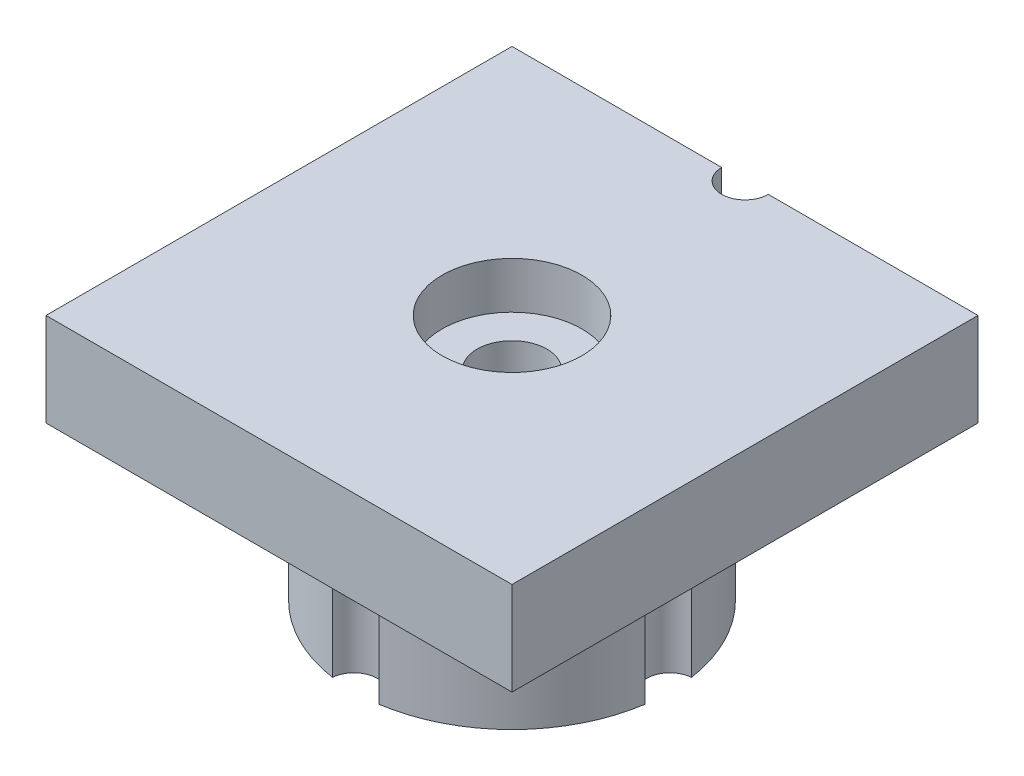
ISO-10303-21;
HEADER;
FILE_DESCRIPTION(('STEP AP214'),'2;1');
FILE_NAME('part.step','',(''),(''),'','','');
FILE_SCHEMA(('AUTOMOTIVE_DESIGN { 1 0 10303 214 1 1 1 1 }'));
ENDSEC;
DATA;
#1=APPLICATION_CONTEXT('core data for automotive mechanical design processes');
#2=APPLICATION_PROTOCOL_DEFINITION('international standard','automotive_design',2000,#1);
#3=PRODUCT_CONTEXT('',#1,'mechanical');
#4=PRODUCT('Part','Part','',(#3));
#5=PRODUCT_RELATED_PRODUCT_CATEGORY('part','',(#4));
#6=PRODUCT_DEFINITION_FORMATION('','',#4);
#7=PRODUCT_DEFINITION_CONTEXT('part definition',#1,'design');
#8=PRODUCT_DEFINITION('design','',#6,#7);
#9=PRODUCT_DEFINITION_SHAPE('','',#8);
#10=(LENGTH_UNIT() NAMED_UNIT(*) SI_UNIT(.MILLI.,.METRE.));
#11=(NAMED_UNIT(*) PLANE_ANGLE_UNIT() SI_UNIT($,.RADIAN.));
#12=(NAMED_UNIT(*) SI_UNIT($,.STERADIAN.) SOLID_ANGLE_UNIT());
#13=UNCERTAINTY_MEASURE_WITH_UNIT(LENGTH_MEASURE(1.E-05),#10,'distance_accuracy_value','');
#14=(GEOMETRIC_REPRESENTATION_CONTEXT(3) GLOBAL_UNCERTAINTY_ASSIGNED_CONTEXT((#13)) GLOBAL_UNIT_ASSIGNED_CONTEXT((#10,
#11,#12)) REPRESENTATION_CONTEXT('',''));
#15=CARTESIAN_POINT('',(0.,0.,0.));
#16=DIRECTION('',(0.,0.,1.));
#17=DIRECTION('',(1.,0.,0.));
#18=AXIS2_PLACEMENT_3D('',#15,#16,#17);
#19=CARTESIAN_POINT('',(-5.,2.,-5.));
#20=DIRECTION('',(0.,0.,1.));
#21=DIRECTION('',(1.,0.,0.));
#22=AXIS2_PLACEMENT_3D('',#19,#20,#21);
#23=PLANE('',#22);
#24=DIRECTION('',(-1.,0.,0.));
#25=VECTOR('',#24,1.);
#26=CARTESIAN_POINT('',(-5.,0.,-5.));
#27=LINE('',#26,#25);
#28=CARTESIAN_POINT('',(5.,0.,-5.));
#29=VERTEX_POINT('',#28);
#30=CARTESIAN_POINT('',(0.499999999999999,0.,-5.));
#31=VERTEX_POINT('',#30);
#32=EDGE_CURVE('E147',#29,#31,#27,.T.);
#33=ORIENTED_EDGE('',*,*,#32,.T.);
#34=DIRECTION('',(0.,1.,0.));
#35=VECTOR('',#34,1.);
#36=CARTESIAN_POINT('',(0.499999999999999,-3.3,-5.));
#37=LINE('',#36,#35);
#38=CARTESIAN_POINT('',(0.499999999999999,2.,-5.));
#39=VERTEX_POINT('',#38);
#40=EDGE_CURVE('E137',#31,#39,#37,.T.);
#41=ORIENTED_EDGE('',*,*,#40,.T.);
#42=DIRECTION('',(-1.,0.,0.));
#43=VECTOR('',#42,1.);
#44=CARTESIAN_POINT('',(-5.,2.,-5.));
#45=LINE('',#44,#43);
#46=CARTESIAN_POINT('',(5.,2.,-5.));
#47=VERTEX_POINT('',#46);
#48=EDGE_CURVE('E145',#47,#39,#45,.T.);
#49=ORIENTED_EDGE('',*,*,#48,.F.);
#50=DIRECTION('',(0.,-1.,0.));
#51=VECTOR('',#50,1.);
#52=CARTESIAN_POINT('',(5.,2.,-5.));
#53=LINE('',#52,#51);
#54=EDGE_CURVE('E11',#47,#29,#53,.T.);
#55=ORIENTED_EDGE('',*,*,#54,.T.);
#56=EDGE_LOOP('',(#33,#41,#49,#55));
#57=FACE_BOUND('',#56,.T.);
#58=ADVANCED_FACE('F35',(#57),#23,.F.);
#59=CARTESIAN_POINT('',(0.,3.3,0.));
#60=DIRECTION('',(0.,-1.,0.));
#61=DIRECTION('',(0.,0.,-1.));
#62=AXIS2_PLACEMENT_3D('',#59,#60,#61);
#63=CYLINDRICAL_SURFACE('',#62,0.75);
#64=CARTESIAN_POINT('',(0.,0.,0.));
#65=DIRECTION('',(0.,-1.,0.));
#66=DIRECTION('',(0.,0.,-1.));
#67=AXIS2_PLACEMENT_3D('',#64,#65,#66);
#68=CIRCLE('',#67,0.75);
#69=CARTESIAN_POINT('',(0.,0.,-0.75));
#70=VERTEX_POINT('',#69);
#71=EDGE_CURVE('E406',#70,#70,#68,.T.);
#72=ORIENTED_EDGE('',*,*,#71,.T.);
#73=EDGE_LOOP('',(#72));
#74=FACE_BOUND('',#73,.T.);
#75=CARTESIAN_POINT('',(0.,1.,0.));
#76=DIRECTION('',(0.,1.,0.));
#77=DIRECTION('',(0.,0.,1.));
#78=AXIS2_PLACEMENT_3D('',#75,#76,#77);
#79=CIRCLE('',#78,0.75);
#80=CARTESIAN_POINT('',(0.,1.,0.75));
#81=VERTEX_POINT('',#80);
#82=EDGE_CURVE('E39',#81,#81,#79,.F.);
#83=ORIENTED_EDGE('',*,*,#82,.F.);
#84=EDGE_LOOP('',(#83));
#85=FACE_BOUND('',#84,.T.);
#86=ADVANCED_FACE('F202',(#74,#85),#63,.F.);
#87=CARTESIAN_POINT('',(0.,0.,0.));
#88=DIRECTION('',(0.,-1.,0.));
#89=DIRECTION('',(0.,0.,-1.));
#90=AXIS2_PLACEMENT_3D('',#87,#88,#89);
#91=PLANE('',#90);
#92=CARTESIAN_POINT('',(0.,0.,-5.));
#93=DIRECTION('',(0.,-1.,0.));
#94=DIRECTION('',(0.,0.,-1.));
#95=AXIS2_PLACEMENT_3D('',#92,#93,#94);
#96=CIRCLE('',#95,0.5);
#97=CARTESIAN_POINT('',(-0.500000000000002,0.,-5.));
#98=VERTEX_POINT('',#97);
#99=EDGE_CURVE('E413',#31,#98,#96,.T.);
#100=ORIENTED_EDGE('',*,*,#99,.F.);
#101=ORIENTED_EDGE('',*,*,#32,.F.);
#102=DIRECTION('',(0.,0.,-1.));
#103=VECTOR('',#102,1.);
#104=CARTESIAN_POINT('',(5.,0.,5.));
#105=LINE('',#104,#103);
#106=CARTESIAN_POINT('',(5.,0.,5.));
#107=VERTEX_POINT('',#106);
#108=EDGE_CURVE('E163',#107,#29,#105,.T.);
#109=ORIENTED_EDGE('',*,*,#108,.F.);
#110=DIRECTION('',(1.,0.,0.));
#111=VECTOR('',#110,1.);
#112=CARTESIAN_POINT('',(-5.,0.,5.));
#113=LINE('',#112,#111);
#114=CARTESIAN_POINT('',(-5.,0.,5.));
#115=VERTEX_POINT('',#114);
#116=EDGE_CURVE('E171',#115,#107,#113,.T.);
#117=ORIENTED_EDGE('',*,*,#116,.F.);
#118=DIRECTION('',(0.,0.,1.));
#119=VECTOR('',#118,1.);
#120=CARTESIAN_POINT('',(-5.,0.,5.));
#121=LINE('',#120,#119);
#122=CARTESIAN_POINT('',(-5.,0.,-5.));
#123=VERTEX_POINT('',#122);
#124=EDGE_CURVE('E169',#123,#115,#121,.T.);
#125=ORIENTED_EDGE('',*,*,#124,.F.);
#126=EDGE_CURVE('E166',#98,#123,#27,.T.);
#127=ORIENTED_EDGE('',*,*,#126,.F.);
#128=EDGE_LOOP('',(#100,#101,#109,#117,#125,#127));
#129=FACE_BOUND('',#128,.T.);
#130=CARTESIAN_POINT('',(0.,0.,0.));
#131=DIRECTION('',(0.,-1.,0.));
#132=DIRECTION('',(0.,0.,-1.));
#133=AXIS2_PLACEMENT_3D('',#130,#131,#132);
#134=CIRCLE('',#133,3.39);
#135=CARTESIAN_POINT('',(3.35312684365782,0.,0.49863851670459));
#136=VERTEX_POINT('',#135);
#137=CARTESIAN_POINT('',(0.498638516704619,0.,3.35312684365782));
#138=VERTEX_POINT('',#137);
#139=EDGE_CURVE('E59',#136,#138,#134,.T.);
#140=ORIENTED_EDGE('',*,*,#139,.F.);
#141=CARTESIAN_POINT('',(3.39,0.,0.));
#142=DIRECTION('',(0.,1.,0.));
#143=DIRECTION('',(0.,0.,-1.));
#144=AXIS2_PLACEMENT_3D('',#141,#142,#143);
#145=CIRCLE('',#144,0.500000000000012);
#146=CARTESIAN_POINT('',(3.35312684365781,0.,-0.498638516704625));
#147=VERTEX_POINT('',#146);
#148=EDGE_CURVE('E426',#147,#136,#145,.T.);
#149=ORIENTED_EDGE('',*,*,#148,.F.);
#150=CARTESIAN_POINT('',(0.,0.,0.));
#151=DIRECTION('',(0.,-1.,0.));
#152=DIRECTION('',(0.,0.,-1.));
#153=AXIS2_PLACEMENT_3D('',#150,#151,#152);
#154=CIRCLE('',#153,3.39);
#155=CARTESIAN_POINT('',(0.498638516704585,0.,-3.35312684365782));
#156=VERTEX_POINT('',#155);
#157=EDGE_CURVE('E457',#156,#147,#154,.T.);
#158=ORIENTED_EDGE('',*,*,#157,.F.);
#159=CARTESIAN_POINT('',(0.,0.,-3.39));
#160=DIRECTION('',(0.,1.,0.));
#161=DIRECTION('',(0.,0.,-1.));
#162=AXIS2_PLACEMENT_3D('',#159,#160,#161);
#163=CIRCLE('',#162,0.500000000000018);
#164=CARTESIAN_POINT('',(-0.498638516704636,0.,-3.35312684365781));
#165=VERTEX_POINT('',#164);
#166=EDGE_CURVE('E454',#165,#156,#163,.T.);
#167=ORIENTED_EDGE('',*,*,#166,.F.);
#168=CARTESIAN_POINT('',(0.,0.,0.));
#169=DIRECTION('',(0.,-1.,0.));
#170=DIRECTION('',(0.,0.,-1.));
#171=AXIS2_PLACEMENT_3D('',#168,#169,#170);
#172=CIRCLE('',#171,3.39);
#173=CARTESIAN_POINT('',(-3.35312684365782,0.,-0.498638516704602));
#174=VERTEX_POINT('',#173);
#175=EDGE_CURVE('E451',#174,#165,#172,.T.);
#176=ORIENTED_EDGE('',*,*,#175,.F.);
#177=CARTESIAN_POINT('',(-3.39,0.,0.));
#178=DIRECTION('',(0.,1.,0.));
#179=DIRECTION('',(0.,0.,-1.));
#180=AXIS2_PLACEMENT_3D('',#177,#178,#179);
#181=CIRCLE('',#180,0.5);
#182=CARTESIAN_POINT('',(-3.35312684365782,0.,0.498638516704603));
#183=VERTEX_POINT('',#182);
#184=EDGE_CURVE('E448',#183,#174,#181,.T.);
#185=ORIENTED_EDGE('',*,*,#184,.F.);
#186=CARTESIAN_POINT('',(0.,0.,0.));
#187=DIRECTION('',(0.,-1.,0.));
#188=DIRECTION('',(0.,0.,-1.));
#189=AXIS2_PLACEMENT_3D('',#186,#187,#188);
#190=CIRCLE('',#189,3.39);
#191=CARTESIAN_POINT('',(-0.498638516704596,0.,3.35312684365782));
#192=VERTEX_POINT('',#191);
#193=EDGE_CURVE('E445',#192,#183,#190,.T.);
#194=ORIENTED_EDGE('',*,*,#193,.F.);
#195=CARTESIAN_POINT('',(0.,0.,3.39));
#196=DIRECTION('',(0.,1.,0.));
#197=DIRECTION('',(0.,0.,-1.));
#198=AXIS2_PLACEMENT_3D('',#195,#196,#197);
#199=CIRCLE('',#198,0.500000000000006);
#200=EDGE_CURVE('E442',#138,#192,#199,.T.);
#201=ORIENTED_EDGE('',*,*,#200,.F.);
#202=EDGE_LOOP('',(#140,#149,#158,#167,#176,#185,#194,#201));
#203=FACE_BOUND('',#202,.T.);
#204=ADVANCED_FACE('F189',(#129,#203),#91,.T.);
#205=CARTESIAN_POINT('',(5.,2.,5.));
#206=DIRECTION('',(-1.,0.,0.));
#207=DIRECTION('',(0.,0.,1.));
#208=AXIS2_PLACEMENT_3D('',#205,#206,#207);
#209=PLANE('',#208);
#210=ORIENTED_EDGE('',*,*,#108,.T.);
#211=ORIENTED_EDGE('',*,*,#54,.F.);
#212=DIRECTION('',(0.,0.,-1.));
#213=VECTOR('',#212,1.);
#214=CARTESIAN_POINT('',(5.,2.,5.));
#215=LINE('',#214,#213);
#216=CARTESIAN_POINT('',(5.,2.,5.));
#217=VERTEX_POINT('',#216);
#218=EDGE_CURVE('E151',#217,#47,#215,.T.);
#219=ORIENTED_EDGE('',*,*,#218,.F.);
#220=DIRECTION('',(0.,-1.,0.));
#221=VECTOR('',#220,1.);
#222=CARTESIAN_POINT('',(5.,2.,5.));
#223=LINE('',#222,#221);
#224=EDGE_CURVE('E162',#217,#107,#223,.T.);
#225=ORIENTED_EDGE('',*,*,#224,.T.);
#226=EDGE_LOOP('',(#210,#211,#219,#225));
#227=FACE_BOUND('',#226,.T.);
#228=ADVANCED_FACE('F37',(#227),#209,.F.);
#229=CARTESIAN_POINT('',(-0.500000000000002,2.,-5.));
#230=VERTEX_POINT('',#229);
#231=CARTESIAN_POINT('',(-5.,2.,-5.));
#232=VERTEX_POINT('',#231);
#233=EDGE_CURVE('E154',#230,#232,#45,.T.);
#234=ORIENTED_EDGE('',*,*,#233,.F.);
#235=DIRECTION('',(0.,1.,0.));
#236=VECTOR('',#235,1.);
#237=CARTESIAN_POINT('',(-0.500000000000002,-3.3,-5.));
#238=LINE('',#237,#236);
#239=EDGE_CURVE('E51',#98,#230,#238,.T.);
#240=ORIENTED_EDGE('',*,*,#239,.F.);
#241=ORIENTED_EDGE('',*,*,#126,.T.);
#242=DIRECTION('',(0.,-1.,0.));
#243=VECTOR('',#242,1.);
#244=CARTESIAN_POINT('',(-5.,2.,-5.));
#245=LINE('',#244,#243);
#246=EDGE_CURVE('E44',#232,#123,#245,.T.);
#247=ORIENTED_EDGE('',*,*,#246,.F.);
#248=EDGE_LOOP('',(#234,#240,#241,#247));
#249=FACE_BOUND('',#248,.T.);
#250=ADVANCED_FACE('F197',(#249),#23,.F.);
#251=CARTESIAN_POINT('',(-5.,2.,5.));
#252=DIRECTION('',(1.,0.,0.));
#253=DIRECTION('',(0.,0.,-1.));
#254=AXIS2_PLACEMENT_3D('',#251,#252,#253);
#255=PLANE('',#254);
#256=ORIENTED_EDGE('',*,*,#124,.T.);
#257=DIRECTION('',(0.,-1.,0.));
#258=VECTOR('',#257,1.);
#259=CARTESIAN_POINT('',(-5.,2.,5.));
#260=LINE('',#259,#258);
#261=CARTESIAN_POINT('',(-5.,2.,5.));
#262=VERTEX_POINT('',#261);
#263=EDGE_CURVE('E175',#262,#115,#260,.T.);
#264=ORIENTED_EDGE('',*,*,#263,.F.);
#265=DIRECTION('',(0.,0.,1.));
#266=VECTOR('',#265,1.);
#267=CARTESIAN_POINT('',(-5.,2.,5.));
#268=LINE('',#267,#266);
#269=EDGE_CURVE('E153',#232,#262,#268,.T.);
#270=ORIENTED_EDGE('',*,*,#269,.F.);
#271=ORIENTED_EDGE('',*,*,#246,.T.);
#272=EDGE_LOOP('',(#256,#264,#270,#271));
#273=FACE_BOUND('',#272,.T.);
#274=ADVANCED_FACE('F183',(#273),#255,.F.);
#275=CARTESIAN_POINT('',(-5.,2.,5.));
#276=DIRECTION('',(0.,0.,-1.));
#277=DIRECTION('',(-1.,0.,0.));
#278=AXIS2_PLACEMENT_3D('',#275,#276,#277);
#279=PLANE('',#278);
#280=ORIENTED_EDGE('',*,*,#116,.T.);
#281=ORIENTED_EDGE('',*,*,#224,.F.);
#282=DIRECTION('',(1.,0.,0.));
#283=VECTOR('',#282,1.);
#284=CARTESIAN_POINT('',(-5.,2.,5.));
#285=LINE('',#284,#283);
#286=EDGE_CURVE('E156',#262,#217,#285,.T.);
#287=ORIENTED_EDGE('',*,*,#286,.F.);
#288=ORIENTED_EDGE('',*,*,#263,.T.);
#289=EDGE_LOOP('',(#280,#281,#287,#288));
#290=FACE_BOUND('',#289,.T.);
#291=ADVANCED_FACE('F193',(#290),#279,.F.);
#292=CARTESIAN_POINT('',(0.,2.,0.));
#293=DIRECTION('',(0.,-1.,0.));
#294=DIRECTION('',(0.,0.,-1.));
#295=AXIS2_PLACEMENT_3D('',#292,#293,#294);
#296=PLANE('',#295);
#297=CARTESIAN_POINT('',(0.,2.,0.));
#298=DIRECTION('',(0.,1.,0.));
#299=DIRECTION('',(0.,0.,1.));
#300=AXIS2_PLACEMENT_3D('',#297,#298,#299);
#301=CIRCLE('',#300,1.5);
#302=CARTESIAN_POINT('',(0.,2.,1.5));
#303=VERTEX_POINT('',#302);
#304=EDGE_CURVE('E410',#303,#303,#301,.T.);
#305=ORIENTED_EDGE('',*,*,#304,.F.);
#306=EDGE_LOOP('',(#305));
#307=FACE_BOUND('',#306,.T.);
#308=ORIENTED_EDGE('',*,*,#48,.T.);
#309=CARTESIAN_POINT('',(0.,2.,-5.));
#310=DIRECTION('',(0.,1.,0.));
#311=DIRECTION('',(0.,0.,1.));
#312=AXIS2_PLACEMENT_3D('',#309,#310,#311);
#313=CIRCLE('',#312,0.5);
#314=EDGE_CURVE('E134',#230,#39,#313,.T.);
#315=ORIENTED_EDGE('',*,*,#314,.F.);
#316=ORIENTED_EDGE('',*,*,#233,.T.);
#317=ORIENTED_EDGE('',*,*,#269,.T.);
#318=ORIENTED_EDGE('',*,*,#286,.T.);
#319=ORIENTED_EDGE('',*,*,#218,.T.);
#320=EDGE_LOOP('',(#308,#315,#316,#317,#318,#319));
#321=FACE_BOUND('',#320,.T.);
#322=ADVANCED_FACE('F149',(#307,#321),#296,.F.);
#323=CARTESIAN_POINT('',(0.,-3.3,0.));
#324=DIRECTION('',(0.,1.,0.));
#325=DIRECTION('',(0.,0.,1.));
#326=AXIS2_PLACEMENT_3D('',#323,#324,#325);
#327=CYLINDRICAL_SURFACE('',#326,3.39);
#328=ORIENTED_EDGE('',*,*,#139,.T.);
#329=DIRECTION('',(0.,1.,0.));
#330=VECTOR('',#329,1.);
#331=CARTESIAN_POINT('',(0.498638516704619,-3.3,3.35312684365782));
#332=LINE('',#331,#330);
#333=CARTESIAN_POINT('',(0.498638516704619,-3.3,3.35312684365782));
#334=VERTEX_POINT('',#333);
#335=EDGE_CURVE('E167',#334,#138,#332,.T.);
#336=ORIENTED_EDGE('',*,*,#335,.F.);
#337=CARTESIAN_POINT('',(0.,-3.3,0.));
#338=DIRECTION('',(0.,-1.,0.));
#339=DIRECTION('',(0.,0.,-1.));
#340=AXIS2_PLACEMENT_3D('',#337,#338,#339);
#341=CIRCLE('',#340,3.39);
#342=CARTESIAN_POINT('',(3.35312684365782,-3.3,0.49863851670459));
#343=VERTEX_POINT('',#342);
#344=EDGE_CURVE('E422',#343,#334,#341,.T.);
#345=ORIENTED_EDGE('',*,*,#344,.F.);
#346=DIRECTION('',(0.,1.,0.));
#347=VECTOR('',#346,1.);
#348=CARTESIAN_POINT('',(3.35312684365782,-3.3,0.49863851670459));
#349=LINE('',#348,#347);
#350=EDGE_CURVE('E440',#343,#136,#349,.T.);
#351=ORIENTED_EDGE('',*,*,#350,.T.);
#352=EDGE_LOOP('',(#328,#336,#345,#351));
#353=FACE_BOUND('',#352,.T.);
#354=ADVANCED_FACE('F217',(#353),#327,.T.);
#355=CARTESIAN_POINT('',(0.,-3.3,3.39));
#356=DIRECTION('',(0.,1.,0.));
#357=DIRECTION('',(0.,0.,1.));
#358=AXIS2_PLACEMENT_3D('',#355,#356,#357);
#359=CYLINDRICAL_SURFACE('',#358,0.500000000000006);
#360=ORIENTED_EDGE('',*,*,#200,.T.);
#361=DIRECTION('',(0.,1.,0.));
#362=VECTOR('',#361,1.);
#363=CARTESIAN_POINT('',(-0.498638516704596,-3.3,3.35312684365782));
#364=LINE('',#363,#362);
#365=CARTESIAN_POINT('',(-0.498638516704596,-3.3,3.35312684365782));
#366=VERTEX_POINT('',#365);
#367=EDGE_CURVE('E478',#366,#192,#364,.T.);
#368=ORIENTED_EDGE('',*,*,#367,.F.);
#369=CARTESIAN_POINT('',(0.,-3.3,3.39));
#370=DIRECTION('',(0.,1.,0.));
#371=DIRECTION('',(0.,0.,-1.));
#372=AXIS2_PLACEMENT_3D('',#369,#370,#371);
#373=CIRCLE('',#372,0.500000000000006);
#374=EDGE_CURVE('E425',#334,#366,#373,.T.);
#375=ORIENTED_EDGE('',*,*,#374,.F.);
#376=ORIENTED_EDGE('',*,*,#335,.T.);
#377=EDGE_LOOP('',(#360,#368,#375,#376));
#378=FACE_BOUND('',#377,.T.);
#379=ADVANCED_FACE('F221',(#378),#359,.F.);
#380=CARTESIAN_POINT('',(0.,-3.3,0.));
#381=DIRECTION('',(0.,1.,0.));
#382=DIRECTION('',(0.,0.,1.));
#383=AXIS2_PLACEMENT_3D('',#380,#381,#382);
#384=CYLINDRICAL_SURFACE('',#383,3.39);
#385=ORIENTED_EDGE('',*,*,#193,.T.);
#386=DIRECTION('',(0.,1.,0.));
#387=VECTOR('',#386,1.);
#388=CARTESIAN_POINT('',(-3.35312684365782,-3.3,0.498638516704603));
#389=LINE('',#388,#387);
#390=CARTESIAN_POINT('',(-3.35312684365782,-3.3,0.498638516704603));
#391=VERTEX_POINT('',#390);
#392=EDGE_CURVE('E475',#391,#183,#389,.T.);
#393=ORIENTED_EDGE('',*,*,#392,.F.);
#394=CARTESIAN_POINT('',(0.,-3.3,0.));
#395=DIRECTION('',(0.,-1.,0.));
#396=DIRECTION('',(0.,0.,-1.));
#397=AXIS2_PLACEMENT_3D('',#394,#395,#396);
#398=CIRCLE('',#397,3.39);
#399=EDGE_CURVE('E428',#366,#391,#398,.T.);
#400=ORIENTED_EDGE('',*,*,#399,.F.);
#401=ORIENTED_EDGE('',*,*,#367,.T.);
#402=EDGE_LOOP('',(#385,#393,#400,#401));
#403=FACE_BOUND('',#402,.T.);
#404=ADVANCED_FACE('F225',(#403),#384,.T.);
#405=CARTESIAN_POINT('',(-3.39,-3.3,0.));
#406=DIRECTION('',(0.,1.,0.));
#407=DIRECTION('',(0.,0.,1.));
#408=AXIS2_PLACEMENT_3D('',#405,#406,#407);
#409=CYLINDRICAL_SURFACE('',#408,0.5);
#410=ORIENTED_EDGE('',*,*,#184,.T.);
#411=DIRECTION('',(0.,1.,0.));
#412=VECTOR('',#411,1.);
#413=CARTESIAN_POINT('',(-3.35312684365782,-3.3,-0.498638516704602));
#414=LINE('',#413,#412);
#415=CARTESIAN_POINT('',(-3.35312684365782,-3.3,-0.498638516704602));
#416=VERTEX_POINT('',#415);
#417=EDGE_CURVE('E472',#416,#174,#414,.T.);
#418=ORIENTED_EDGE('',*,*,#417,.F.);
#419=CARTESIAN_POINT('',(-3.39,-3.3,0.));
#420=DIRECTION('',(0.,1.,0.));
#421=DIRECTION('',(0.,0.,-1.));
#422=AXIS2_PLACEMENT_3D('',#419,#420,#421);
#423=CIRCLE('',#422,0.5);
#424=EDGE_CURVE('E430',#391,#416,#423,.T.);
#425=ORIENTED_EDGE('',*,*,#424,.F.);
#426=ORIENTED_EDGE('',*,*,#392,.T.);
#427=EDGE_LOOP('',(#410,#418,#425,#426));
#428=FACE_BOUND('',#427,.T.);
#429=ADVANCED_FACE('F229',(#428),#409,.F.);
#430=CARTESIAN_POINT('',(0.,-3.3,0.));
#431=DIRECTION('',(0.,1.,0.));
#432=DIRECTION('',(0.,0.,1.));
#433=AXIS2_PLACEMENT_3D('',#430,#431,#432);
#434=CYLINDRICAL_SURFACE('',#433,3.39);
#435=ORIENTED_EDGE('',*,*,#175,.T.);
#436=DIRECTION('',(0.,1.,0.));
#437=VECTOR('',#436,1.);
#438=CARTESIAN_POINT('',(-0.498638516704636,-3.3,-3.35312684365781));
#439=LINE('',#438,#437);
#440=CARTESIAN_POINT('',(-0.498638516704636,-3.3,-3.35312684365781));
#441=VERTEX_POINT('',#440);
#442=EDGE_CURVE('E469',#441,#165,#439,.T.);
#443=ORIENTED_EDGE('',*,*,#442,.F.);
#444=CARTESIAN_POINT('',(0.,-3.3,0.));
#445=DIRECTION('',(0.,-1.,0.));
#446=DIRECTION('',(0.,0.,-1.));
#447=AXIS2_PLACEMENT_3D('',#444,#445,#446);
#448=CIRCLE('',#447,3.39);
#449=EDGE_CURVE('E432',#416,#441,#448,.T.);
#450=ORIENTED_EDGE('',*,*,#449,.F.);
#451=ORIENTED_EDGE('',*,*,#417,.T.);
#452=EDGE_LOOP('',(#435,#443,#450,#451));
#453=FACE_BOUND('',#452,.T.);
#454=ADVANCED_FACE('F233',(#453),#434,.T.);
#455=CARTESIAN_POINT('',(0.,-3.3,-3.39));
#456=DIRECTION('',(0.,1.,0.));
#457=DIRECTION('',(0.,0.,1.));
#458=AXIS2_PLACEMENT_3D('',#455,#456,#457);
#459=CYLINDRICAL_SURFACE('',#458,0.500000000000018);
#460=ORIENTED_EDGE('',*,*,#166,.T.);
#461=DIRECTION('',(0.,1.,0.));
#462=VECTOR('',#461,1.);
#463=CARTESIAN_POINT('',(0.498638516704585,-3.3,-3.35312684365782));
#464=LINE('',#463,#462);
#465=CARTESIAN_POINT('',(0.498638516704585,-3.3,-3.35312684365782));
#466=VERTEX_POINT('',#465);
#467=EDGE_CURVE('E466',#466,#156,#464,.T.);
#468=ORIENTED_EDGE('',*,*,#467,.F.);
#469=CARTESIAN_POINT('',(0.,-3.3,-3.39));
#470=DIRECTION('',(0.,1.,0.));
#471=DIRECTION('',(0.,0.,-1.));
#472=AXIS2_PLACEMENT_3D('',#469,#470,#471);
#473=CIRCLE('',#472,0.500000000000018);
#474=EDGE_CURVE('E434',#441,#466,#473,.T.);
#475=ORIENTED_EDGE('',*,*,#474,.F.);
#476=ORIENTED_EDGE('',*,*,#442,.T.);
#477=EDGE_LOOP('',(#460,#468,#475,#476));
#478=FACE_BOUND('',#477,.T.);
#479=ADVANCED_FACE('F237',(#478),#459,.F.);
#480=CARTESIAN_POINT('',(0.,-3.3,0.));
#481=DIRECTION('',(0.,1.,0.));
#482=DIRECTION('',(0.,0.,1.));
#483=AXIS2_PLACEMENT_3D('',#480,#481,#482);
#484=CYLINDRICAL_SURFACE('',#483,3.39);
#485=ORIENTED_EDGE('',*,*,#157,.T.);
#486=DIRECTION('',(0.,1.,0.));
#487=VECTOR('',#486,1.);
#488=CARTESIAN_POINT('',(3.35312684365781,-3.3,-0.498638516704625));
#489=LINE('',#488,#487);
#490=CARTESIAN_POINT('',(3.35312684365781,-3.3,-0.498638516704625));
#491=VERTEX_POINT('',#490);
#492=EDGE_CURVE('E463',#491,#147,#489,.T.);
#493=ORIENTED_EDGE('',*,*,#492,.F.);
#494=CARTESIAN_POINT('',(0.,-3.3,0.));
#495=DIRECTION('',(0.,-1.,0.));
#496=DIRECTION('',(0.,0.,-1.));
#497=AXIS2_PLACEMENT_3D('',#494,#495,#496);
#498=CIRCLE('',#497,3.39);
#499=EDGE_CURVE('E436',#466,#491,#498,.T.);
#500=ORIENTED_EDGE('',*,*,#499,.F.);
#501=ORIENTED_EDGE('',*,*,#467,.T.);
#502=EDGE_LOOP('',(#485,#493,#500,#501));
#503=FACE_BOUND('',#502,.T.);
#504=ADVANCED_FACE('F241',(#503),#484,.T.);
#505=CARTESIAN_POINT('',(3.39,-3.3,0.));
#506=DIRECTION('',(0.,1.,0.));
#507=DIRECTION('',(0.,0.,1.));
#508=AXIS2_PLACEMENT_3D('',#505,#506,#507);
#509=CYLINDRICAL_SURFACE('',#508,0.500000000000012);
#510=ORIENTED_EDGE('',*,*,#148,.T.);
#511=ORIENTED_EDGE('',*,*,#350,.F.);
#512=CARTESIAN_POINT('',(3.39,-3.3,0.));
#513=DIRECTION('',(0.,1.,0.));
#514=DIRECTION('',(0.,0.,-1.));
#515=AXIS2_PLACEMENT_3D('',#512,#513,#514);
#516=CIRCLE('',#515,0.500000000000012);
#517=EDGE_CURVE('E438',#491,#343,#516,.T.);
#518=ORIENTED_EDGE('',*,*,#517,.F.);
#519=ORIENTED_EDGE('',*,*,#492,.T.);
#520=EDGE_LOOP('',(#510,#511,#518,#519));
#521=FACE_BOUND('',#520,.T.);
#522=ADVANCED_FACE('F245',(#521),#509,.F.);
#523=CARTESIAN_POINT('',(0.,-3.3,1.695));
#524=DIRECTION('',(0.,-1.,0.));
#525=DIRECTION('',(0.,0.,-1.));
#526=AXIS2_PLACEMENT_3D('',#523,#524,#525);
#527=PLANE('',#526);
#528=CARTESIAN_POINT('',(0.,-3.3,0.));
#529=DIRECTION('',(0.,-1.,0.));
#530=DIRECTION('',(0.,0.,-1.));
#531=AXIS2_PLACEMENT_3D('',#528,#529,#530);
#532=CIRCLE('',#531,2.);
#533=CARTESIAN_POINT('',(0.,-3.3,-2.));
#534=VERTEX_POINT('',#533);
#535=EDGE_CURVE('E408',#534,#534,#532,.T.);
#536=ORIENTED_EDGE('',*,*,#535,.F.);
#537=EDGE_LOOP('',(#536));
#538=FACE_BOUND('',#537,.T.);
#539=ORIENTED_EDGE('',*,*,#344,.T.);
#540=ORIENTED_EDGE('',*,*,#374,.T.);
#541=ORIENTED_EDGE('',*,*,#399,.T.);
#542=ORIENTED_EDGE('',*,*,#424,.T.);
#543=ORIENTED_EDGE('',*,*,#449,.T.);
#544=ORIENTED_EDGE('',*,*,#474,.T.);
#545=ORIENTED_EDGE('',*,*,#499,.T.);
#546=ORIENTED_EDGE('',*,*,#517,.T.);
#547=EDGE_LOOP('',(#539,#540,#541,#542,#543,#544,#545,#546));
#548=FACE_BOUND('',#547,.T.);
#549=ADVANCED_FACE('F249',(#538,#548),#527,.T.);
#550=CARTESIAN_POINT('',(0.,0.,0.));
#551=DIRECTION('',(0.,-1.,0.));
#552=DIRECTION('',(0.,0.,-1.));
#553=AXIS2_PLACEMENT_3D('',#550,#551,#552);
#554=CYLINDRICAL_SURFACE('',#553,2.);
#555=CARTESIAN_POINT('',(0.,0.,0.));
#556=DIRECTION('',(0.,-1.,0.));
#557=DIRECTION('',(0.,0.,-1.));
#558=AXIS2_PLACEMENT_3D('',#555,#556,#557);
#559=CIRCLE('',#558,2.);
#560=CARTESIAN_POINT('',(0.,0.,-2.));
#561=VERTEX_POINT('',#560);
#562=EDGE_CURVE('E417',#561,#561,#559,.T.);
#563=ORIENTED_EDGE('',*,*,#562,.F.);
#564=EDGE_LOOP('',(#563));
#565=FACE_BOUND('',#564,.T.);
#566=ORIENTED_EDGE('',*,*,#535,.T.);
#567=EDGE_LOOP('',(#566));
#568=FACE_BOUND('',#567,.T.);
#569=ADVANCED_FACE('F253',(#565,#568),#554,.F.);
#570=CARTESIAN_POINT('',(0.,0.,0.));
#571=DIRECTION('',(0.,-1.,0.));
#572=DIRECTION('',(0.,0.,-1.));
#573=AXIS2_PLACEMENT_3D('',#570,#571,#572);
#574=PLANE('',#573);
#575=ORIENTED_EDGE('',*,*,#71,.F.);
#576=EDGE_LOOP('',(#575));
#577=FACE_BOUND('',#576,.T.);
#578=ORIENTED_EDGE('',*,*,#562,.T.);
#579=EDGE_LOOP('',(#578));
#580=FACE_BOUND('',#579,.T.);
#581=ADVANCED_FACE('F257',(#577,#580),#574,.T.);
#582=CARTESIAN_POINT('',(0.,1.,0.));
#583=DIRECTION('',(0.,1.,0.));
#584=DIRECTION('',(0.,0.,1.));
#585=AXIS2_PLACEMENT_3D('',#582,#583,#584);
#586=PLANE('',#585);
#587=CARTESIAN_POINT('',(0.,1.,0.));
#588=DIRECTION('',(0.,1.,0.));
#589=DIRECTION('',(0.,0.,1.));
#590=AXIS2_PLACEMENT_3D('',#587,#588,#589);
#591=CIRCLE('',#590,1.5);
#592=CARTESIAN_POINT('',(0.,1.,1.5));
#593=VERTEX_POINT('',#592);
#594=EDGE_CURVE('E402',#593,#593,#591,.T.);
#595=ORIENTED_EDGE('',*,*,#594,.T.);
#596=EDGE_LOOP('',(#595));
#597=FACE_BOUND('',#596,.T.);
#598=ORIENTED_EDGE('',*,*,#82,.T.);
#599=EDGE_LOOP('',(#598));
#600=FACE_BOUND('',#599,.T.);
#601=ADVANCED_FACE('F260',(#597,#600),#586,.T.);
#602=CARTESIAN_POINT('',(0.,1.,0.));
#603=DIRECTION('',(0.,1.,0.));
#604=DIRECTION('',(0.,0.,1.));
#605=AXIS2_PLACEMENT_3D('',#602,#603,#604);
#606=CYLINDRICAL_SURFACE('',#605,1.5);
#607=ORIENTED_EDGE('',*,*,#594,.F.);
#608=EDGE_LOOP('',(#607));
#609=FACE_BOUND('',#608,.T.);
#610=ORIENTED_EDGE('',*,*,#304,.T.);
#611=EDGE_LOOP('',(#610));
#612=FACE_BOUND('',#611,.T.);
#613=ADVANCED_FACE('F263',(#609,#612),#606,.F.);
#614=CARTESIAN_POINT('',(0.,-3.3,-5.));
#615=DIRECTION('',(0.,1.,0.));
#616=DIRECTION('',(0.,0.,1.));
#617=AXIS2_PLACEMENT_3D('',#614,#615,#616);
#618=CYLINDRICAL_SURFACE('',#617,0.5);
#619=ORIENTED_EDGE('',*,*,#99,.T.);
#620=ORIENTED_EDGE('',*,*,#239,.T.);
#621=ORIENTED_EDGE('',*,*,#314,.T.);
#622=ORIENTED_EDGE('',*,*,#40,.F.);
#623=EDGE_LOOP('',(#619,#620,#621,#622));
#624=FACE_BOUND('',#623,.T.);
#625=ADVANCED_FACE('F136',(#624),#618,.F.);
#626=CLOSED_SHELL('',(#58,#86,#204,#228,#250,#274,#291,#322,#354,#379,#404,#429,#454,#479,#504,
#522,#549,#569,#581,#601,#613,#625));
#627=MANIFOLD_SOLID_BREP('B2',#626);
#628=ADVANCED_BREP_SHAPE_REPRESENTATION('',(#18,#627),#14);
#629=SHAPE_DEFINITION_REPRESENTATION(#9,#628);
ENDSEC;
END-ISO-10303-21;
